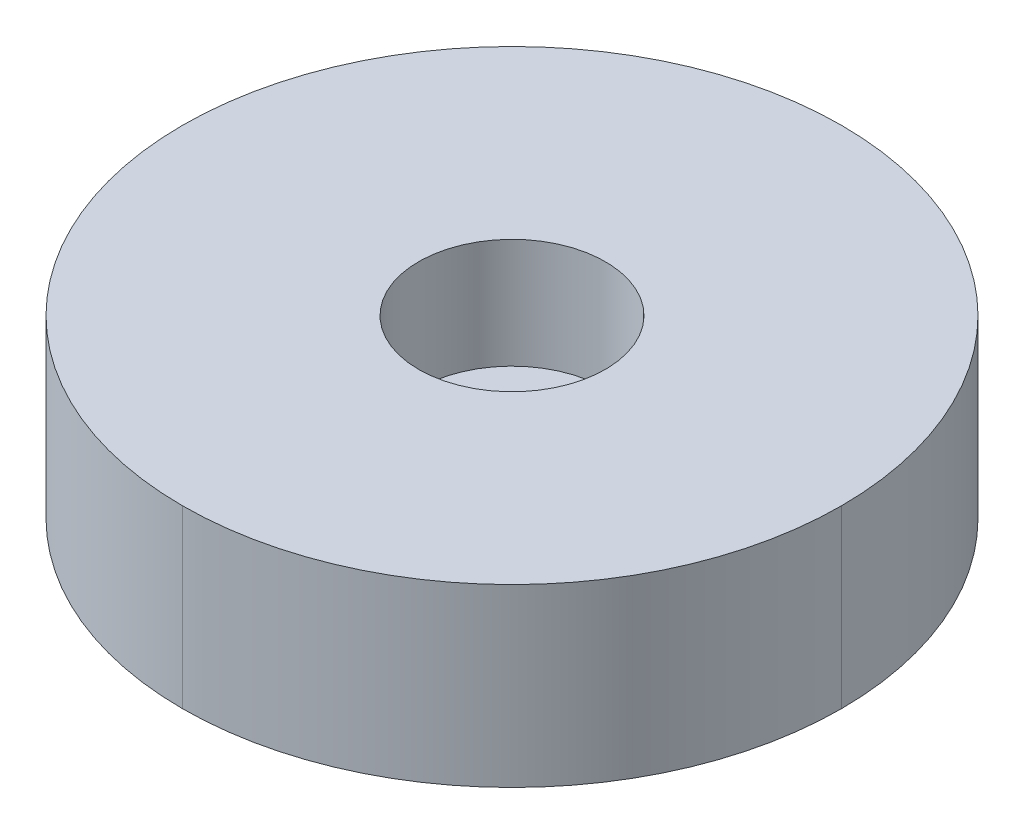
ISO-10303-21;
HEADER;
FILE_DESCRIPTION(('STEP AP214'),'2;1');
FILE_NAME('part.step','',(''),(''),'','','');
FILE_SCHEMA(('AUTOMOTIVE_DESIGN { 1 0 10303 214 1 1 1 1 }'));
ENDSEC;
DATA;
#1=APPLICATION_CONTEXT('core data for automotive mechanical design processes');
#2=APPLICATION_PROTOCOL_DEFINITION('international standard','automotive_design',2000,#1);
#3=PRODUCT_CONTEXT('',#1,'mechanical');
#4=PRODUCT('Part','Part','',(#3));
#5=PRODUCT_RELATED_PRODUCT_CATEGORY('part','',(#4));
#6=PRODUCT_DEFINITION_FORMATION('','',#4);
#7=PRODUCT_DEFINITION_CONTEXT('part definition',#1,'design');
#8=PRODUCT_DEFINITION('design','',#6,#7);
#9=PRODUCT_DEFINITION_SHAPE('','',#8);
#10=(LENGTH_UNIT() NAMED_UNIT(*) SI_UNIT(.MILLI.,.METRE.));
#11=(NAMED_UNIT(*) PLANE_ANGLE_UNIT() SI_UNIT($,.RADIAN.));
#12=(NAMED_UNIT(*) SI_UNIT($,.STERADIAN.) SOLID_ANGLE_UNIT());
#13=UNCERTAINTY_MEASURE_WITH_UNIT(LENGTH_MEASURE(1.E-05),#10,'distance_accuracy_value','');
#14=(GEOMETRIC_REPRESENTATION_CONTEXT(3) GLOBAL_UNCERTAINTY_ASSIGNED_CONTEXT((#13)) GLOBAL_UNIT_ASSIGNED_CONTEXT((#10,
#11,#12)) REPRESENTATION_CONTEXT('',''));
#15=CARTESIAN_POINT('',(0.,0.,0.));
#16=DIRECTION('',(0.,0.,1.));
#17=DIRECTION('',(1.,0.,0.));
#18=AXIS2_PLACEMENT_3D('',#15,#16,#17);
#19=CARTESIAN_POINT('',(0.,8.,0.));
#20=DIRECTION('',(0.,1.,0.));
#21=DIRECTION('',(0.,0.,1.));
#22=AXIS2_PLACEMENT_3D('',#19,#20,#21);
#23=PLANE('',#22);
#24=CARTESIAN_POINT('',(-4.26121372031662,8.,7.9419525065963));
#25=DIRECTION('',(0.,1.,0.));
#26=DIRECTION('',(0.,0.,1.));
#27=AXIS2_PLACEMENT_3D('',#24,#25,#26);
#28=CIRCLE('',#27,4.25);
#29=CARTESIAN_POINT('',(-4.26121372031662,8.,12.1919525065963));
#30=VERTEX_POINT('',#29);
#31=EDGE_CURVE('E95',#30,#30,#28,.T.);
#32=ORIENTED_EDGE('',*,*,#31,.F.);
#33=EDGE_LOOP('',(#32));
#34=FACE_BOUND('',#33,.T.);
#35=CARTESIAN_POINT('',(-4.26121372031662,8.,7.94195250659631));
#36=DIRECTION('',(0.,1.,0.));
#37=DIRECTION('',(0.,0.,1.));
#38=AXIS2_PLACEMENT_3D('',#35,#36,#37);
#39=CIRCLE('',#38,15.);
#40=CARTESIAN_POINT('',(-19.2612137203166,8.,7.94195250659631));
#41=VERTEX_POINT('',#40);
#42=CARTESIAN_POINT('',(-4.26121372031663,8.,22.9419525065963));
#43=VERTEX_POINT('',#42);
#44=EDGE_CURVE('E41',#41,#43,#39,.T.);
#45=ORIENTED_EDGE('',*,*,#44,.T.);
#46=CARTESIAN_POINT('',(-4.26121372031662,8.,7.94195250659631));
#47=DIRECTION('',(0.,1.,0.));
#48=DIRECTION('',(0.,0.,1.));
#49=AXIS2_PLACEMENT_3D('',#46,#47,#48);
#50=CIRCLE('',#49,15.);
#51=CARTESIAN_POINT('',(10.7387862796834,8.,7.94195250659631));
#52=VERTEX_POINT('',#51);
#53=EDGE_CURVE('E11',#43,#52,#50,.T.);
#54=ORIENTED_EDGE('',*,*,#53,.T.);
#55=CARTESIAN_POINT('',(-4.26121372031662,8.,7.94195250659631));
#56=DIRECTION('',(0.,1.,0.));
#57=DIRECTION('',(0.,0.,1.));
#58=AXIS2_PLACEMENT_3D('',#55,#56,#57);
#59=CIRCLE('',#58,15.);
#60=CARTESIAN_POINT('',(-4.26121372031662,8.,-7.05804749340369));
#61=VERTEX_POINT('',#60);
#62=EDGE_CURVE('E48',#52,#61,#59,.T.);
#63=ORIENTED_EDGE('',*,*,#62,.T.);
#64=CARTESIAN_POINT('',(-4.26121372031662,8.,7.94195250659631));
#65=DIRECTION('',(0.,1.,0.));
#66=DIRECTION('',(0.,0.,1.));
#67=AXIS2_PLACEMENT_3D('',#64,#65,#66);
#68=CIRCLE('',#67,15.);
#69=EDGE_CURVE('E105',#61,#41,#68,.T.);
#70=ORIENTED_EDGE('',*,*,#69,.T.);
#71=EDGE_LOOP('',(#45,#54,#63,#70));
#72=FACE_BOUND('',#71,.T.);
#73=ADVANCED_FACE('F32',(#34,#72),#23,.T.);
#74=CARTESIAN_POINT('',(0.,0.,0.));
#75=DIRECTION('',(0.,1.,0.));
#76=DIRECTION('',(0.,0.,1.));
#77=AXIS2_PLACEMENT_3D('',#74,#75,#76);
#78=PLANE('',#77);
#79=CARTESIAN_POINT('',(-4.26121372031662,0.,7.94195250659631));
#80=DIRECTION('',(0.,1.,0.));
#81=DIRECTION('',(0.,0.,1.));
#82=AXIS2_PLACEMENT_3D('',#79,#80,#81);
#83=CIRCLE('',#82,15.);
#84=CARTESIAN_POINT('',(-4.26121372031662,0.,-7.05804749340369));
#85=VERTEX_POINT('',#84);
#86=CARTESIAN_POINT('',(10.7387862796834,0.,7.94195250659631));
#87=VERTEX_POINT('',#86);
#88=EDGE_CURVE('E92',#85,#87,#83,.F.);
#89=ORIENTED_EDGE('',*,*,#88,.T.);
#90=CARTESIAN_POINT('',(-4.26121372031662,0.,7.94195250659631));
#91=DIRECTION('',(0.,1.,0.));
#92=DIRECTION('',(0.,0.,1.));
#93=AXIS2_PLACEMENT_3D('',#90,#91,#92);
#94=CIRCLE('',#93,15.);
#95=CARTESIAN_POINT('',(-4.26121372031663,0.,22.9419525065963));
#96=VERTEX_POINT('',#95);
#97=EDGE_CURVE('E81',#87,#96,#94,.F.);
#98=ORIENTED_EDGE('',*,*,#97,.T.);
#99=CARTESIAN_POINT('',(-4.26121372031662,0.,7.94195250659631));
#100=DIRECTION('',(0.,1.,0.));
#101=DIRECTION('',(0.,0.,1.));
#102=AXIS2_PLACEMENT_3D('',#99,#100,#101);
#103=CIRCLE('',#102,15.);
#104=CARTESIAN_POINT('',(-19.2612137203166,0.,7.94195250659631));
#105=VERTEX_POINT('',#104);
#106=EDGE_CURVE('E76',#96,#105,#103,.F.);
#107=ORIENTED_EDGE('',*,*,#106,.T.);
#108=CARTESIAN_POINT('',(-4.26121372031662,0.,7.94195250659631));
#109=DIRECTION('',(0.,1.,0.));
#110=DIRECTION('',(0.,0.,1.));
#111=AXIS2_PLACEMENT_3D('',#108,#109,#110);
#112=CIRCLE('',#111,15.);
#113=EDGE_CURVE('E79',#105,#85,#112,.F.);
#114=ORIENTED_EDGE('',*,*,#113,.T.);
#115=EDGE_LOOP('',(#89,#98,#107,#114));
#116=FACE_BOUND('',#115,.T.);
#117=ADVANCED_FACE('F78',(#116),#78,.F.);
#118=CARTESIAN_POINT('',(-4.26121372031662,3.,7.9419525065963));
#119=DIRECTION('',(0.,1.,0.));
#120=DIRECTION('',(0.,0.,1.));
#121=AXIS2_PLACEMENT_3D('',#118,#119,#120);
#122=CYLINDRICAL_SURFACE('',#121,4.25);
#123=CARTESIAN_POINT('',(-4.26121372031662,3.,7.9419525065963));
#124=DIRECTION('',(0.,1.,0.));
#125=DIRECTION('',(0.,0.,1.));
#126=AXIS2_PLACEMENT_3D('',#123,#124,#125);
#127=CIRCLE('',#126,4.25);
#128=CARTESIAN_POINT('',(-4.26121372031662,3.,12.1919525065963));
#129=VERTEX_POINT('',#128);
#130=EDGE_CURVE('E97',#129,#129,#127,.T.);
#131=ORIENTED_EDGE('',*,*,#130,.F.);
#132=EDGE_LOOP('',(#131));
#133=FACE_BOUND('',#132,.T.);
#134=ORIENTED_EDGE('',*,*,#31,.T.);
#135=EDGE_LOOP('',(#134));
#136=FACE_BOUND('',#135,.T.);
#137=ADVANCED_FACE('F115',(#133,#136),#122,.F.);
#138=CARTESIAN_POINT('',(-4.26121372031662,3.,7.9419525065963));
#139=DIRECTION('',(0.,1.,0.));
#140=DIRECTION('',(0.,0.,1.));
#141=AXIS2_PLACEMENT_3D('',#138,#139,#140);
#142=PLANE('',#141);
#143=ORIENTED_EDGE('',*,*,#130,.T.);
#144=EDGE_LOOP('',(#143));
#145=FACE_BOUND('',#144,.T.);
#146=ADVANCED_FACE('F113',(#145),#142,.T.);
#147=CARTESIAN_POINT('',(-4.26121372031662,8.,7.94195250659631));
#148=DIRECTION('',(0.,-1.,0.));
#149=DIRECTION('',(0.,0.,-1.));
#150=AXIS2_PLACEMENT_3D('',#147,#148,#149);
#151=CYLINDRICAL_SURFACE('',#150,15.);
#152=DIRECTION('',(0.,-1.,0.));
#153=VECTOR('',#152,1.);
#154=CARTESIAN_POINT('',(-4.26121372031662,8.,-7.05804749340369));
#155=LINE('',#154,#153);
#156=EDGE_CURVE('E90',#85,#61,#155,.F.);
#157=ORIENTED_EDGE('',*,*,#156,.F.);
#158=ORIENTED_EDGE('',*,*,#113,.F.);
#159=DIRECTION('',(0.,-1.,0.));
#160=VECTOR('',#159,1.);
#161=CARTESIAN_POINT('',(-19.2612137203166,8.,7.94195250659631));
#162=LINE('',#161,#160);
#163=EDGE_CURVE('E36',#41,#105,#162,.T.);
#164=ORIENTED_EDGE('',*,*,#163,.F.);
#165=ORIENTED_EDGE('',*,*,#69,.F.);
#166=EDGE_LOOP('',(#157,#158,#164,#165));
#167=FACE_BOUND('',#166,.T.);
#168=ADVANCED_FACE('F34',(#167),#151,.T.);
#169=CARTESIAN_POINT('',(-4.26121372031662,8.,7.94195250659631));
#170=DIRECTION('',(0.,-1.,0.));
#171=DIRECTION('',(0.,0.,-1.));
#172=AXIS2_PLACEMENT_3D('',#169,#170,#171);
#173=CYLINDRICAL_SURFACE('',#172,15.);
#174=ORIENTED_EDGE('',*,*,#163,.T.);
#175=ORIENTED_EDGE('',*,*,#106,.F.);
#176=DIRECTION('',(0.,-1.,0.));
#177=VECTOR('',#176,1.);
#178=CARTESIAN_POINT('',(-4.26121372031662,8.,22.9419525065963));
#179=LINE('',#178,#177);
#180=EDGE_CURVE('E99',#43,#96,#179,.T.);
#181=ORIENTED_EDGE('',*,*,#180,.F.);
#182=ORIENTED_EDGE('',*,*,#44,.F.);
#183=EDGE_LOOP('',(#174,#175,#181,#182));
#184=FACE_BOUND('',#183,.T.);
#185=ADVANCED_FACE('F94',(#184),#173,.T.);
#186=CARTESIAN_POINT('',(-4.26121372031662,8.,7.94195250659631));
#187=DIRECTION('',(0.,-1.,0.));
#188=DIRECTION('',(0.,0.,-1.));
#189=AXIS2_PLACEMENT_3D('',#186,#187,#188);
#190=CYLINDRICAL_SURFACE('',#189,15.);
#191=ORIENTED_EDGE('',*,*,#156,.T.);
#192=ORIENTED_EDGE('',*,*,#62,.F.);
#193=DIRECTION('',(0.,-1.,0.));
#194=VECTOR('',#193,1.);
#195=CARTESIAN_POINT('',(10.7387862796834,8.,7.94195250659631));
#196=LINE('',#195,#194);
#197=EDGE_CURVE('E56',#87,#52,#196,.F.);
#198=ORIENTED_EDGE('',*,*,#197,.F.);
#199=ORIENTED_EDGE('',*,*,#88,.F.);
#200=EDGE_LOOP('',(#191,#192,#198,#199));
#201=FACE_BOUND('',#200,.T.);
#202=ADVANCED_FACE('F125',(#201),#190,.T.);
#203=CARTESIAN_POINT('',(-4.26121372031662,8.,7.94195250659631));
#204=DIRECTION('',(0.,-1.,0.));
#205=DIRECTION('',(0.,0.,-1.));
#206=AXIS2_PLACEMENT_3D('',#203,#204,#205);
#207=CYLINDRICAL_SURFACE('',#206,15.);
#208=ORIENTED_EDGE('',*,*,#53,.F.);
#209=ORIENTED_EDGE('',*,*,#180,.T.);
#210=ORIENTED_EDGE('',*,*,#97,.F.);
#211=ORIENTED_EDGE('',*,*,#197,.T.);
#212=EDGE_LOOP('',(#208,#209,#210,#211));
#213=FACE_BOUND('',#212,.T.);
#214=ADVANCED_FACE('F123',(#213),#207,.T.);
#215=CLOSED_SHELL('',(#73,#117,#137,#146,#168,#185,#202,#214));
#216=MANIFOLD_SOLID_BREP('B2',#215);
#217=ADVANCED_BREP_SHAPE_REPRESENTATION('',(#18,#216),#14);
#218=SHAPE_DEFINITION_REPRESENTATION(#9,#217);
ENDSEC;
END-ISO-10303-21;
